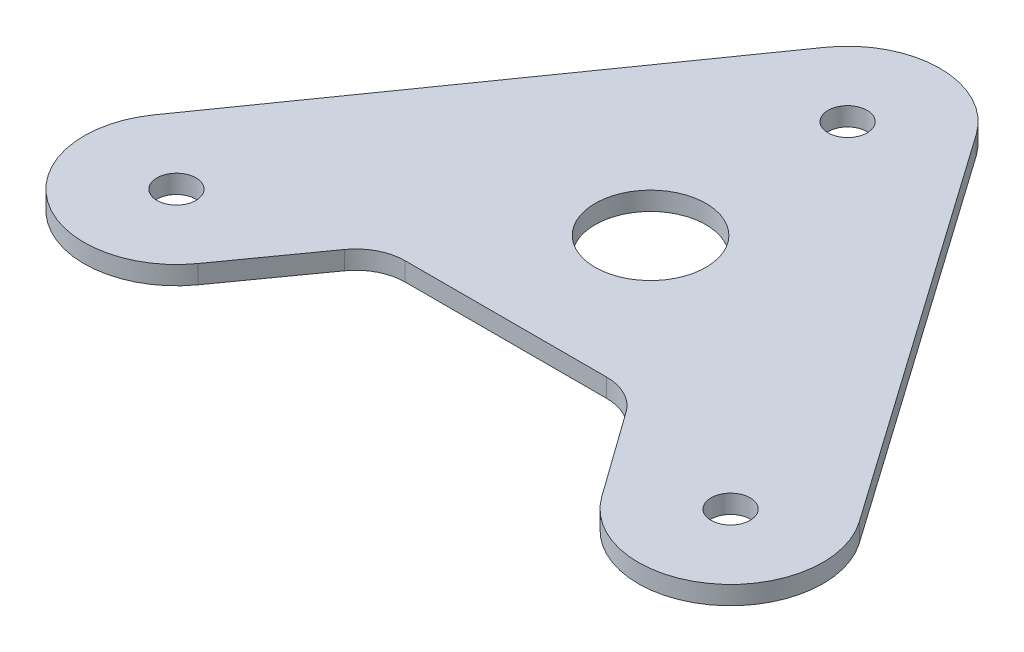
ISO-10303-21;
HEADER;
FILE_DESCRIPTION(('STEP AP214'),'2;1');
FILE_NAME('part.step','',(''),(''),'','','');
FILE_SCHEMA(('AUTOMOTIVE_DESIGN { 1 0 10303 214 1 1 1 1 }'));
ENDSEC;
DATA;
#1=APPLICATION_CONTEXT('core data for automotive mechanical design processes');
#2=APPLICATION_PROTOCOL_DEFINITION('international standard','automotive_design',2000,#1);
#3=PRODUCT_CONTEXT('',#1,'mechanical');
#4=PRODUCT('Part','Part','',(#3));
#5=PRODUCT_RELATED_PRODUCT_CATEGORY('part','',(#4));
#6=PRODUCT_DEFINITION_FORMATION('','',#4);
#7=PRODUCT_DEFINITION_CONTEXT('part definition',#1,'design');
#8=PRODUCT_DEFINITION('design','',#6,#7);
#9=PRODUCT_DEFINITION_SHAPE('','',#8);
#10=(LENGTH_UNIT() NAMED_UNIT(*) SI_UNIT(.MILLI.,.METRE.));
#11=(NAMED_UNIT(*) PLANE_ANGLE_UNIT() SI_UNIT($,.RADIAN.));
#12=(NAMED_UNIT(*) SI_UNIT($,.STERADIAN.) SOLID_ANGLE_UNIT());
#13=UNCERTAINTY_MEASURE_WITH_UNIT(LENGTH_MEASURE(1.E-05),#10,'distance_accuracy_value','');
#14=(GEOMETRIC_REPRESENTATION_CONTEXT(3) GLOBAL_UNCERTAINTY_ASSIGNED_CONTEXT((#13)) GLOBAL_UNIT_ASSIGNED_CONTEXT((#10,
#11,#12)) REPRESENTATION_CONTEXT('',''));
#15=CARTESIAN_POINT('',(0.,0.,0.));
#16=DIRECTION('',(0.,0.,1.));
#17=DIRECTION('',(1.,0.,0.));
#18=AXIS2_PLACEMENT_3D('',#15,#16,#17);
#19=CARTESIAN_POINT('',(-45.,3.,51.6990291262136));
#20=DIRECTION('',(0.,-1.,0.));
#21=DIRECTION('',(0.,0.,-1.));
#22=AXIS2_PLACEMENT_3D('',#19,#20,#21);
#23=CYLINDRICAL_SURFACE('',#22,15.);
#24=CARTESIAN_POINT('',(-45.,0.,51.6990291262136));
#25=DIRECTION('',(0.,1.,0.));
#26=DIRECTION('',(0.,0.,1.));
#27=AXIS2_PLACEMENT_3D('',#24,#25,#26);
#28=CIRCLE('',#27,15.);
#29=CARTESIAN_POINT('',(-57.2704373757921,0.,43.0713778463598));
#30=VERTEX_POINT('',#29);
#31=CARTESIAN_POINT('',(-32.7997142999671,0.,60.4255994053997));
#32=VERTEX_POINT('',#31);
#33=EDGE_CURVE('E158',#30,#32,#28,.T.);
#34=ORIENTED_EDGE('',*,*,#33,.T.);
#35=DIRECTION('',(0.,-1.,0.));
#36=VECTOR('',#35,1.);
#37=CARTESIAN_POINT('',(-32.7997142999671,3.,60.4255994053997));
#38=LINE('',#37,#36);
#39=CARTESIAN_POINT('',(-32.7997142999671,3.,60.4255994053997));
#40=VERTEX_POINT('',#39);
#41=EDGE_CURVE('E11',#40,#32,#38,.T.);
#42=ORIENTED_EDGE('',*,*,#41,.F.);
#43=CARTESIAN_POINT('',(-45.,3.,51.6990291262136));
#44=DIRECTION('',(0.,1.,0.));
#45=DIRECTION('',(0.,0.,1.));
#46=AXIS2_PLACEMENT_3D('',#43,#44,#45);
#47=CIRCLE('',#46,15.);
#48=CARTESIAN_POINT('',(-57.2704373757921,3.,43.0713778463598));
#49=VERTEX_POINT('',#48);
#50=EDGE_CURVE('E226',#49,#40,#47,.T.);
#51=ORIENTED_EDGE('',*,*,#50,.F.);
#52=DIRECTION('',(0.,-1.,0.));
#53=VECTOR('',#52,1.);
#54=CARTESIAN_POINT('',(-57.2704373757921,3.,43.0713778463598));
#55=LINE('',#54,#53);
#56=EDGE_CURVE('E51',#49,#30,#55,.T.);
#57=ORIENTED_EDGE('',*,*,#56,.T.);
#58=EDGE_LOOP('',(#34,#42,#51,#57));
#59=FACE_BOUND('',#58,.T.);
#60=ADVANCED_FACE('F34',(#59),#23,.T.);
#61=CARTESIAN_POINT('',(6.89410244396006,3.,4.93118529912489));
#62=DIRECTION('',(-0.813352380002192,0.,-0.581771351945736));
#63=DIRECTION('',(-0.581771351945736,0.,0.813352380002192));
#64=AXIS2_PLACEMENT_3D('',#61,#62,#63);
#65=PLANE('',#64);
#66=DIRECTION('',(0.581771351945736,0.,-0.813352380002192));
#67=VECTOR('',#66,1.);
#68=CARTESIAN_POINT('',(6.89410244396006,0.,4.93118529912489));
#69=LINE('',#68,#67);
#70=CARTESIAN_POINT('',(-22.8711547835115,0.,46.5448583106477));
#71=VERTEX_POINT('',#70);
#72=EDGE_CURVE('E160',#32,#71,#69,.T.);
#73=ORIENTED_EDGE('',*,*,#72,.T.);
#74=DIRECTION('',(0.,-1.,0.));
#75=VECTOR('',#74,1.);
#76=CARTESIAN_POINT('',(-22.8711547835115,3.,46.5448583106477));
#77=LINE('',#76,#75);
#78=CARTESIAN_POINT('',(-22.8711547835115,3.,46.5448583106477));
#79=VERTEX_POINT('',#78);
#80=EDGE_CURVE('E43',#79,#71,#77,.T.);
#81=ORIENTED_EDGE('',*,*,#80,.F.);
#82=DIRECTION('',(0.581771351945736,0.,-0.813352380002192));
#83=VECTOR('',#82,1.);
#84=CARTESIAN_POINT('',(6.89410244396006,3.,4.93118529912489));
#85=LINE('',#84,#83);
#86=EDGE_CURVE('E96',#40,#79,#85,.T.);
#87=ORIENTED_EDGE('',*,*,#86,.F.);
#88=ORIENTED_EDGE('',*,*,#41,.T.);
#89=EDGE_LOOP('',(#73,#81,#87,#88));
#90=FACE_BOUND('',#89,.T.);
#91=ADVANCED_FACE('F209',(#90),#65,.F.);
#92=CARTESIAN_POINT('',(-16.364335743494,3.,51.1990291262136));
#93=DIRECTION('',(0.,-1.,0.));
#94=DIRECTION('',(0.,0.,-1.));
#95=AXIS2_PLACEMENT_3D('',#92,#93,#94);
#96=CYLINDRICAL_SURFACE('',#95,8.);
#97=CARTESIAN_POINT('',(-16.364335743494,0.,51.1990291262136));
#98=DIRECTION('',(0.,1.,0.));
#99=DIRECTION('',(0.,0.,1.));
#100=AXIS2_PLACEMENT_3D('',#97,#98,#99);
#101=CIRCLE('',#100,8.);
#102=CARTESIAN_POINT('',(-16.364335743494,0.,43.1990291262136));
#103=VERTEX_POINT('',#102);
#104=EDGE_CURVE('E163',#103,#71,#101,.T.);
#105=ORIENTED_EDGE('',*,*,#104,.F.);
#106=DIRECTION('',(0.,-1.,0.));
#107=VECTOR('',#106,1.);
#108=CARTESIAN_POINT('',(-16.364335743494,3.,43.1990291262136));
#109=LINE('',#108,#107);
#110=CARTESIAN_POINT('',(-16.364335743494,3.,43.1990291262136));
#111=VERTEX_POINT('',#110);
#112=EDGE_CURVE('E202',#111,#103,#109,.T.);
#113=ORIENTED_EDGE('',*,*,#112,.F.);
#114=CARTESIAN_POINT('',(-16.364335743494,3.,51.1990291262136));
#115=DIRECTION('',(0.,1.,0.));
#116=DIRECTION('',(0.,0.,1.));
#117=AXIS2_PLACEMENT_3D('',#114,#115,#116);
#118=CIRCLE('',#117,8.);
#119=EDGE_CURVE('E208',#111,#79,#118,.T.);
#120=ORIENTED_EDGE('',*,*,#119,.T.);
#121=ORIENTED_EDGE('',*,*,#80,.T.);
#122=EDGE_LOOP('',(#105,#113,#120,#121));
#123=FACE_BOUND('',#122,.T.);
#124=ADVANCED_FACE('F206',(#123),#96,.F.);
#125=CARTESIAN_POINT('',(0.,3.,43.1990291262136));
#126=DIRECTION('',(0.,0.,1.));
#127=DIRECTION('',(1.,0.,0.));
#128=AXIS2_PLACEMENT_3D('',#125,#126,#127);
#129=PLANE('',#128);
#130=DIRECTION('',(-1.,0.,0.));
#131=VECTOR('',#130,1.);
#132=CARTESIAN_POINT('',(0.,0.,43.1990291262136));
#133=LINE('',#132,#131);
#134=CARTESIAN_POINT('',(16.364335743494,0.,43.1990291262136));
#135=VERTEX_POINT('',#134);
#136=EDGE_CURVE('E166',#135,#103,#133,.T.);
#137=ORIENTED_EDGE('',*,*,#136,.F.);
#138=DIRECTION('',(0.,-1.,0.));
#139=VECTOR('',#138,1.);
#140=CARTESIAN_POINT('',(16.364335743494,3.,43.1990291262136));
#141=LINE('',#140,#139);
#142=CARTESIAN_POINT('',(16.364335743494,3.,43.1990291262136));
#143=VERTEX_POINT('',#142);
#144=EDGE_CURVE('E200',#143,#135,#141,.T.);
#145=ORIENTED_EDGE('',*,*,#144,.F.);
#146=DIRECTION('',(-1.,0.,0.));
#147=VECTOR('',#146,1.);
#148=CARTESIAN_POINT('',(0.,3.,43.1990291262136));
#149=LINE('',#148,#147);
#150=EDGE_CURVE('E220',#143,#111,#149,.T.);
#151=ORIENTED_EDGE('',*,*,#150,.T.);
#152=ORIENTED_EDGE('',*,*,#112,.T.);
#153=EDGE_LOOP('',(#137,#145,#151,#152));
#154=FACE_BOUND('',#153,.T.);
#155=ADVANCED_FACE('F217',(#154),#129,.T.);
#156=CARTESIAN_POINT('',(16.364335743494,3.,51.1990291262136));
#157=DIRECTION('',(0.,-1.,0.));
#158=DIRECTION('',(0.,0.,-1.));
#159=AXIS2_PLACEMENT_3D('',#156,#157,#158);
#160=CYLINDRICAL_SURFACE('',#159,8.);
#161=CARTESIAN_POINT('',(16.364335743494,0.,51.1990291262136));
#162=DIRECTION('',(0.,1.,0.));
#163=DIRECTION('',(0.,0.,1.));
#164=AXIS2_PLACEMENT_3D('',#161,#162,#163);
#165=CIRCLE('',#164,8.);
#166=CARTESIAN_POINT('',(22.8711547835115,0.,46.5448583106477));
#167=VERTEX_POINT('',#166);
#168=EDGE_CURVE('E169',#167,#135,#165,.T.);
#169=ORIENTED_EDGE('',*,*,#168,.F.);
#170=DIRECTION('',(0.,-1.,0.));
#171=VECTOR('',#170,1.);
#172=CARTESIAN_POINT('',(22.8711547835115,3.,46.5448583106477));
#173=LINE('',#172,#171);
#174=CARTESIAN_POINT('',(22.8711547835115,3.,46.5448583106477));
#175=VERTEX_POINT('',#174);
#176=EDGE_CURVE('E198',#175,#167,#173,.T.);
#177=ORIENTED_EDGE('',*,*,#176,.F.);
#178=CARTESIAN_POINT('',(16.364335743494,3.,51.1990291262136));
#179=DIRECTION('',(0.,1.,0.));
#180=DIRECTION('',(0.,0.,1.));
#181=AXIS2_PLACEMENT_3D('',#178,#179,#180);
#182=CIRCLE('',#181,8.);
#183=EDGE_CURVE('E224',#175,#143,#182,.T.);
#184=ORIENTED_EDGE('',*,*,#183,.T.);
#185=ORIENTED_EDGE('',*,*,#144,.T.);
#186=EDGE_LOOP('',(#169,#177,#184,#185));
#187=FACE_BOUND('',#186,.T.);
#188=ADVANCED_FACE('F237',(#187),#160,.F.);
#189=CARTESIAN_POINT('',(-6.89410244396,3.,4.93118529912483));
#190=DIRECTION('',(-0.813352380002193,0.,0.581771351945735));
#191=DIRECTION('',(0.581771351945735,0.,0.813352380002193));
#192=AXIS2_PLACEMENT_3D('',#189,#190,#191);
#193=PLANE('',#192);
#194=DIRECTION('',(-0.581771351945735,0.,-0.813352380002193));
#195=VECTOR('',#194,1.);
#196=CARTESIAN_POINT('',(-6.89410244396,0.,4.93118529912483));
#197=LINE('',#196,#195);
#198=CARTESIAN_POINT('',(32.799714299966,0.,60.4255994053986));
#199=VERTEX_POINT('',#198);
#200=EDGE_CURVE('E172',#199,#167,#197,.T.);
#201=ORIENTED_EDGE('',*,*,#200,.F.);
#202=DIRECTION('',(0.,-1.,0.));
#203=VECTOR('',#202,1.);
#204=CARTESIAN_POINT('',(32.799714299966,3.,60.4255994053986));
#205=LINE('',#204,#203);
#206=CARTESIAN_POINT('',(32.799714299966,3.,60.4255994053986));
#207=VERTEX_POINT('',#206);
#208=EDGE_CURVE('E196',#207,#199,#205,.T.);
#209=ORIENTED_EDGE('',*,*,#208,.F.);
#210=DIRECTION('',(-0.581771351945735,0.,-0.813352380002193));
#211=VECTOR('',#210,1.);
#212=CARTESIAN_POINT('',(-6.89410244396,3.,4.93118529912483));
#213=LINE('',#212,#211);
#214=EDGE_CURVE('E231',#207,#175,#213,.T.);
#215=ORIENTED_EDGE('',*,*,#214,.T.);
#216=ORIENTED_EDGE('',*,*,#176,.T.);
#217=EDGE_LOOP('',(#201,#209,#215,#216));
#218=FACE_BOUND('',#217,.T.);
#219=ADVANCED_FACE('F235',(#218),#193,.T.);
#220=CARTESIAN_POINT('',(44.9999999999991,3.,51.6990291262124));
#221=DIRECTION('',(0.,-1.,0.));
#222=DIRECTION('',(0.,0.,-1.));
#223=AXIS2_PLACEMENT_3D('',#220,#221,#222);
#224=CYLINDRICAL_SURFACE('',#223,15.0000000000005);
#225=CARTESIAN_POINT('',(44.9999999999991,0.,51.6990291262124));
#226=DIRECTION('',(0.,1.,0.));
#227=DIRECTION('',(0.,0.,1.));
#228=AXIS2_PLACEMENT_3D('',#225,#226,#227);
#229=CIRCLE('',#228,15.0000000000005);
#230=CARTESIAN_POINT('',(57.2704373757916,0.,43.0713778463582));
#231=VERTEX_POINT('',#230);
#232=EDGE_CURVE('E175',#199,#231,#229,.T.);
#233=ORIENTED_EDGE('',*,*,#232,.T.);
#234=DIRECTION('',(0.,-1.,0.));
#235=VECTOR('',#234,1.);
#236=CARTESIAN_POINT('',(57.2704373757916,3.,43.0713778463582));
#237=LINE('',#236,#235);
#238=CARTESIAN_POINT('',(57.2704373757916,3.,43.0713778463582));
#239=VERTEX_POINT('',#238);
#240=EDGE_CURVE('E138',#239,#231,#237,.T.);
#241=ORIENTED_EDGE('',*,*,#240,.F.);
#242=CARTESIAN_POINT('',(44.9999999999991,3.,51.6990291262124));
#243=DIRECTION('',(0.,1.,0.));
#244=DIRECTION('',(0.,0.,1.));
#245=AXIS2_PLACEMENT_3D('',#242,#243,#244);
#246=CIRCLE('',#245,15.0000000000005);
#247=EDGE_CURVE('E126',#207,#239,#246,.T.);
#248=ORIENTED_EDGE('',*,*,#247,.F.);
#249=ORIENTED_EDGE('',*,*,#208,.T.);
#250=EDGE_LOOP('',(#233,#241,#248,#249));
#251=FACE_BOUND('',#250,.T.);
#252=ADVANCED_FACE('F240',(#251),#224,.T.);
#253=CARTESIAN_POINT('',(18.0581838414848,3.,-12.6971605135441));
#254=DIRECTION('',(-0.818029158386139,0.,0.575176751990261));
#255=DIRECTION('',(0.575176751990261,0.,0.818029158386139));
#256=AXIS2_PLACEMENT_3D('',#253,#254,#255);
#257=PLANE('',#256);
#258=DIRECTION('',(-0.575176751990261,0.,-0.818029158386139));
#259=VECTOR('',#258,1.);
#260=CARTESIAN_POINT('',(18.0581838414848,0.,-12.6971605135441));
#261=LINE('',#260,#259);
#262=CARTESIAN_POINT('',(12.2704373757921,0.,-20.9286221536403));
#263=VERTEX_POINT('',#262);
#264=EDGE_CURVE('E135',#231,#263,#261,.T.);
#265=ORIENTED_EDGE('',*,*,#264,.T.);
#266=DIRECTION('',(0.,-1.,0.));
#267=VECTOR('',#266,1.);
#268=CARTESIAN_POINT('',(12.2704373757921,3.,-20.9286221536403));
#269=LINE('',#268,#267);
#270=CARTESIAN_POINT('',(12.2704373757921,3.,-20.9286221536403));
#271=VERTEX_POINT('',#270);
#272=EDGE_CURVE('E132',#271,#263,#269,.T.);
#273=ORIENTED_EDGE('',*,*,#272,.F.);
#274=DIRECTION('',(-0.575176751990261,0.,-0.818029158386139));
#275=VECTOR('',#274,1.);
#276=CARTESIAN_POINT('',(18.0581838414848,3.,-12.6971605135441));
#277=LINE('',#276,#275);
#278=EDGE_CURVE('E117',#239,#271,#277,.T.);
#279=ORIENTED_EDGE('',*,*,#278,.F.);
#280=ORIENTED_EDGE('',*,*,#240,.T.);
#281=EDGE_LOOP('',(#265,#273,#279,#280));
#282=FACE_BOUND('',#281,.T.);
#283=ADVANCED_FACE('F133',(#282),#257,.F.);
#284=CARTESIAN_POINT('',(0.,3.,-12.3009708737864));
#285=DIRECTION('',(0.,-1.,0.));
#286=DIRECTION('',(0.,0.,-1.));
#287=AXIS2_PLACEMENT_3D('',#284,#285,#286);
#288=CYLINDRICAL_SURFACE('',#287,15.);
#289=CARTESIAN_POINT('',(0.,0.,-12.3009708737864));
#290=DIRECTION('',(0.,1.,0.));
#291=DIRECTION('',(0.,0.,1.));
#292=AXIS2_PLACEMENT_3D('',#289,#290,#291);
#293=CIRCLE('',#292,15.);
#294=CARTESIAN_POINT('',(-12.2704373757921,0.,-20.9286221536402));
#295=VERTEX_POINT('',#294);
#296=EDGE_CURVE('E178',#263,#295,#293,.T.);
#297=ORIENTED_EDGE('',*,*,#296,.T.);
#298=DIRECTION('',(0.,-1.,0.));
#299=VECTOR('',#298,1.);
#300=CARTESIAN_POINT('',(-12.2704373757921,3.,-20.9286221536402));
#301=LINE('',#300,#299);
#302=CARTESIAN_POINT('',(-12.2704373757921,3.,-20.9286221536402));
#303=VERTEX_POINT('',#302);
#304=EDGE_CURVE('E84',#303,#295,#301,.T.);
#305=ORIENTED_EDGE('',*,*,#304,.F.);
#306=CARTESIAN_POINT('',(0.,3.,-12.3009708737864));
#307=DIRECTION('',(0.,1.,0.));
#308=DIRECTION('',(0.,0.,1.));
#309=AXIS2_PLACEMENT_3D('',#306,#307,#308);
#310=CIRCLE('',#309,15.);
#311=EDGE_CURVE('E123',#271,#303,#310,.T.);
#312=ORIENTED_EDGE('',*,*,#311,.F.);
#313=ORIENTED_EDGE('',*,*,#272,.T.);
#314=EDGE_LOOP('',(#297,#305,#312,#313));
#315=FACE_BOUND('',#314,.T.);
#316=ADVANCED_FACE('F140',(#315),#288,.T.);
#317=CARTESIAN_POINT('',(0.,3.,-12.3009708737864));
#318=DIRECTION('',(0.,-1.,0.));
#319=DIRECTION('',(0.,0.,-1.));
#320=AXIS2_PLACEMENT_3D('',#317,#318,#319);
#321=CYLINDRICAL_SURFACE('',#320,3.175);
#322=CARTESIAN_POINT('',(0.,3.,-12.3009708737864));
#323=DIRECTION('',(0.,1.,0.));
#324=DIRECTION('',(0.,0.,1.));
#325=AXIS2_PLACEMENT_3D('',#322,#323,#324);
#326=CIRCLE('',#325,3.175);
#327=CARTESIAN_POINT('',(0.,3.,-9.12597087378638));
#328=VERTEX_POINT('',#327);
#329=EDGE_CURVE('E149',#328,#328,#326,.T.);
#330=ORIENTED_EDGE('',*,*,#329,.T.);
#331=EDGE_LOOP('',(#330));
#332=FACE_BOUND('',#331,.T.);
#333=CARTESIAN_POINT('',(0.,0.,-12.3009708737864));
#334=DIRECTION('',(0.,1.,0.));
#335=DIRECTION('',(0.,0.,1.));
#336=AXIS2_PLACEMENT_3D('',#333,#334,#335);
#337=CIRCLE('',#336,3.175);
#338=CARTESIAN_POINT('',(0.,0.,-9.12597087378638));
#339=VERTEX_POINT('',#338);
#340=EDGE_CURVE('E186',#339,#339,#337,.T.);
#341=ORIENTED_EDGE('',*,*,#340,.F.);
#342=EDGE_LOOP('',(#341));
#343=FACE_BOUND('',#342,.T.);
#344=ADVANCED_FACE('F287',(#332,#343),#321,.F.);
#345=CARTESIAN_POINT('',(0.,3.,19.6990291262136));
#346=DIRECTION('',(0.,-1.,0.));
#347=DIRECTION('',(0.,0.,-1.));
#348=AXIS2_PLACEMENT_3D('',#345,#346,#347);
#349=CYLINDRICAL_SURFACE('',#348,9.);
#350=CARTESIAN_POINT('',(0.,3.,19.6990291262136));
#351=DIRECTION('',(0.,1.,0.));
#352=DIRECTION('',(0.,0.,1.));
#353=AXIS2_PLACEMENT_3D('',#350,#351,#352);
#354=CIRCLE('',#353,9.);
#355=CARTESIAN_POINT('',(0.,3.,28.6990291262136));
#356=VERTEX_POINT('',#355);
#357=EDGE_CURVE('E143',#356,#356,#354,.T.);
#358=ORIENTED_EDGE('',*,*,#357,.T.);
#359=EDGE_LOOP('',(#358));
#360=FACE_BOUND('',#359,.T.);
#361=CARTESIAN_POINT('',(0.,0.,19.6990291262136));
#362=DIRECTION('',(0.,1.,0.));
#363=DIRECTION('',(0.,0.,1.));
#364=AXIS2_PLACEMENT_3D('',#361,#362,#363);
#365=CIRCLE('',#364,9.);
#366=CARTESIAN_POINT('',(0.,0.,28.6990291262136));
#367=VERTEX_POINT('',#366);
#368=EDGE_CURVE('E183',#367,#367,#365,.T.);
#369=ORIENTED_EDGE('',*,*,#368,.F.);
#370=EDGE_LOOP('',(#369));
#371=FACE_BOUND('',#370,.T.);
#372=ADVANCED_FACE('F296',(#360,#371),#349,.F.);
#373=CARTESIAN_POINT('',(-18.0581838414848,3.,-12.697160513544));
#374=DIRECTION('',(-0.818029158386142,0.,-0.575176751990256));
#375=DIRECTION('',(-0.575176751990256,0.,0.818029158386142));
#376=AXIS2_PLACEMENT_3D('',#373,#374,#375);
#377=PLANE('',#376);
#378=DIRECTION('',(0.575176751990256,0.,-0.818029158386142));
#379=VECTOR('',#378,1.);
#380=CARTESIAN_POINT('',(-18.0581838414848,0.,-12.697160513544));
#381=LINE('',#380,#379);
#382=EDGE_CURVE('E180',#30,#295,#381,.T.);
#383=ORIENTED_EDGE('',*,*,#382,.F.);
#384=ORIENTED_EDGE('',*,*,#56,.F.);
#385=DIRECTION('',(0.575176751990256,0.,-0.818029158386142));
#386=VECTOR('',#385,1.);
#387=CARTESIAN_POINT('',(-18.0581838414848,3.,-12.697160513544));
#388=LINE('',#387,#386);
#389=EDGE_CURVE('E141',#49,#303,#388,.T.);
#390=ORIENTED_EDGE('',*,*,#389,.T.);
#391=ORIENTED_EDGE('',*,*,#304,.T.);
#392=EDGE_LOOP('',(#383,#384,#390,#391));
#393=FACE_BOUND('',#392,.T.);
#394=ADVANCED_FACE('F306',(#393),#377,.T.);
#395=CARTESIAN_POINT('',(-45.,3.,51.6990291262136));
#396=DIRECTION('',(0.,-1.,0.));
#397=DIRECTION('',(0.,0.,-1.));
#398=AXIS2_PLACEMENT_3D('',#395,#396,#397);
#399=CYLINDRICAL_SURFACE('',#398,3.175);
#400=CARTESIAN_POINT('',(-45.,3.,51.6990291262136));
#401=DIRECTION('',(0.,1.,0.));
#402=DIRECTION('',(0.,0.,1.));
#403=AXIS2_PLACEMENT_3D('',#400,#401,#402);
#404=CIRCLE('',#403,3.175);
#405=CARTESIAN_POINT('',(-45.,3.,54.8740291262136));
#406=VERTEX_POINT('',#405);
#407=EDGE_CURVE('E192',#406,#406,#404,.T.);
#408=ORIENTED_EDGE('',*,*,#407,.T.);
#409=EDGE_LOOP('',(#408));
#410=FACE_BOUND('',#409,.T.);
#411=CARTESIAN_POINT('',(-45.,0.,51.6990291262136));
#412=DIRECTION('',(0.,1.,0.));
#413=DIRECTION('',(0.,0.,1.));
#414=AXIS2_PLACEMENT_3D('',#411,#412,#413);
#415=CIRCLE('',#414,3.175);
#416=CARTESIAN_POINT('',(-45.,0.,54.8740291262136));
#417=VERTEX_POINT('',#416);
#418=EDGE_CURVE('E155',#417,#417,#415,.T.);
#419=ORIENTED_EDGE('',*,*,#418,.F.);
#420=EDGE_LOOP('',(#419));
#421=FACE_BOUND('',#420,.T.);
#422=ADVANCED_FACE('F36',(#410,#421),#399,.F.);
#423=CARTESIAN_POINT('',(44.9999999999991,3.,51.6990291262124));
#424=DIRECTION('',(0.,-1.,0.));
#425=DIRECTION('',(0.,0.,-1.));
#426=AXIS2_PLACEMENT_3D('',#423,#424,#425);
#427=CYLINDRICAL_SURFACE('',#426,3.175);
#428=CARTESIAN_POINT('',(44.9999999999991,3.,51.6990291262124));
#429=DIRECTION('',(0.,1.,0.));
#430=DIRECTION('',(0.,0.,1.));
#431=AXIS2_PLACEMENT_3D('',#428,#429,#430);
#432=CIRCLE('',#431,3.175);
#433=CARTESIAN_POINT('',(44.9999999999991,3.,54.8740291262124));
#434=VERTEX_POINT('',#433);
#435=EDGE_CURVE('E152',#434,#434,#432,.T.);
#436=ORIENTED_EDGE('',*,*,#435,.T.);
#437=EDGE_LOOP('',(#436));
#438=FACE_BOUND('',#437,.T.);
#439=CARTESIAN_POINT('',(44.9999999999991,0.,51.6990291262124));
#440=DIRECTION('',(0.,1.,0.));
#441=DIRECTION('',(0.,0.,1.));
#442=AXIS2_PLACEMENT_3D('',#439,#440,#441);
#443=CIRCLE('',#442,3.175);
#444=CARTESIAN_POINT('',(44.9999999999991,0.,54.8740291262124));
#445=VERTEX_POINT('',#444);
#446=EDGE_CURVE('E189',#445,#445,#443,.T.);
#447=ORIENTED_EDGE('',*,*,#446,.F.);
#448=EDGE_LOOP('',(#447));
#449=FACE_BOUND('',#448,.T.);
#450=ADVANCED_FACE('F324',(#438,#449),#427,.F.);
#451=CARTESIAN_POINT('',(0.,3.,0.));
#452=DIRECTION('',(0.,1.,0.));
#453=DIRECTION('',(0.,0.,1.));
#454=AXIS2_PLACEMENT_3D('',#451,#452,#453);
#455=PLANE('',#454);
#456=ORIENTED_EDGE('',*,*,#407,.F.);
#457=EDGE_LOOP('',(#456));
#458=FACE_BOUND('',#457,.T.);
#459=ORIENTED_EDGE('',*,*,#50,.T.);
#460=ORIENTED_EDGE('',*,*,#86,.T.);
#461=ORIENTED_EDGE('',*,*,#119,.F.);
#462=ORIENTED_EDGE('',*,*,#150,.F.);
#463=ORIENTED_EDGE('',*,*,#183,.F.);
#464=ORIENTED_EDGE('',*,*,#214,.F.);
#465=ORIENTED_EDGE('',*,*,#247,.T.);
#466=ORIENTED_EDGE('',*,*,#278,.T.);
#467=ORIENTED_EDGE('',*,*,#311,.T.);
#468=ORIENTED_EDGE('',*,*,#389,.F.);
#469=EDGE_LOOP('',(#459,#460,#461,#462,#463,#464,#465,#466,#467,#468));
#470=FACE_BOUND('',#469,.T.);
#471=ORIENTED_EDGE('',*,*,#357,.F.);
#472=EDGE_LOOP('',(#471));
#473=FACE_BOUND('',#472,.T.);
#474=ORIENTED_EDGE('',*,*,#329,.F.);
#475=EDGE_LOOP('',(#474));
#476=FACE_BOUND('',#475,.T.);
#477=ORIENTED_EDGE('',*,*,#435,.F.);
#478=EDGE_LOOP('',(#477));
#479=FACE_BOUND('',#478,.T.);
#480=ADVANCED_FACE('F119',(#458,#470,#473,#476,#479),#455,.T.);
#481=CARTESIAN_POINT('',(0.,0.,0.));
#482=DIRECTION('',(0.,1.,0.));
#483=DIRECTION('',(0.,0.,1.));
#484=AXIS2_PLACEMENT_3D('',#481,#482,#483);
#485=PLANE('',#484);
#486=ORIENTED_EDGE('',*,*,#418,.T.);
#487=EDGE_LOOP('',(#486));
#488=FACE_BOUND('',#487,.T.);
#489=ORIENTED_EDGE('',*,*,#33,.F.);
#490=ORIENTED_EDGE('',*,*,#382,.T.);
#491=ORIENTED_EDGE('',*,*,#296,.F.);
#492=ORIENTED_EDGE('',*,*,#264,.F.);
#493=ORIENTED_EDGE('',*,*,#232,.F.);
#494=ORIENTED_EDGE('',*,*,#200,.T.);
#495=ORIENTED_EDGE('',*,*,#168,.T.);
#496=ORIENTED_EDGE('',*,*,#136,.T.);
#497=ORIENTED_EDGE('',*,*,#104,.T.);
#498=ORIENTED_EDGE('',*,*,#72,.F.);
#499=EDGE_LOOP('',(#489,#490,#491,#492,#493,#494,#495,#496,#497,#498));
#500=FACE_BOUND('',#499,.T.);
#501=ORIENTED_EDGE('',*,*,#368,.T.);
#502=EDGE_LOOP('',(#501));
#503=FACE_BOUND('',#502,.T.);
#504=ORIENTED_EDGE('',*,*,#340,.T.);
#505=EDGE_LOOP('',(#504));
#506=FACE_BOUND('',#505,.T.);
#507=ORIENTED_EDGE('',*,*,#446,.T.);
#508=EDGE_LOOP('',(#507));
#509=FACE_BOUND('',#508,.T.);
#510=ADVANCED_FACE('F212',(#488,#500,#503,#506,#509),#485,.F.);
#511=CLOSED_SHELL('',(#60,#91,#124,#155,#188,#219,#252,#283,#316,#344,#372,#394,#422,#450,#480,#510));
#512=MANIFOLD_SOLID_BREP('B2',#511);
#513=ADVANCED_BREP_SHAPE_REPRESENTATION('',(#18,#512),#14);
#514=SHAPE_DEFINITION_REPRESENTATION(#9,#513);
ENDSEC;
END-ISO-10303-21;
